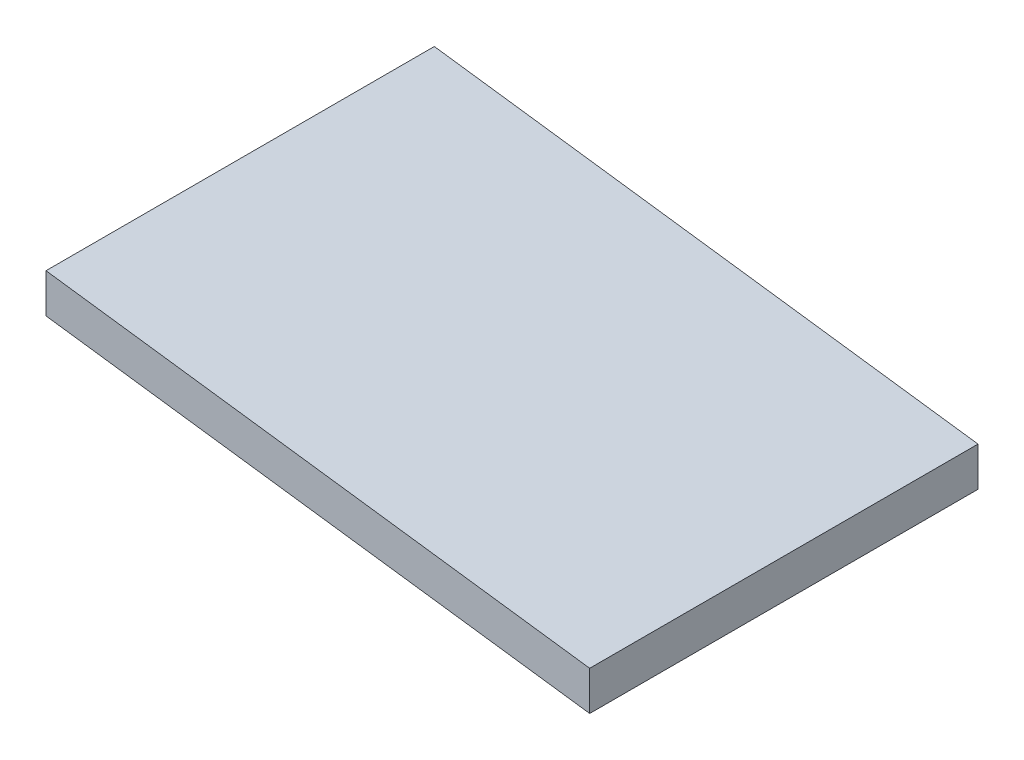
ISO-10303-21;
HEADER;
FILE_DESCRIPTION(('STEP AP214'),'2;1');
FILE_NAME('part.step','',(''),(''),'','','');
FILE_SCHEMA(('AUTOMOTIVE_DESIGN { 1 0 10303 214 1 1 1 1 }'));
ENDSEC;
DATA;
#1=APPLICATION_CONTEXT('core data for automotive mechanical design processes');
#2=APPLICATION_PROTOCOL_DEFINITION('international standard','automotive_design',2000,#1);
#3=PRODUCT_CONTEXT('',#1,'mechanical');
#4=PRODUCT('Part','Part','',(#3));
#5=PRODUCT_RELATED_PRODUCT_CATEGORY('part','',(#4));
#6=PRODUCT_DEFINITION_FORMATION('','',#4);
#7=PRODUCT_DEFINITION_CONTEXT('part definition',#1,'design');
#8=PRODUCT_DEFINITION('design','',#6,#7);
#9=PRODUCT_DEFINITION_SHAPE('','',#8);
#10=(LENGTH_UNIT() NAMED_UNIT(*) SI_UNIT(.MILLI.,.METRE.));
#11=(NAMED_UNIT(*) PLANE_ANGLE_UNIT() SI_UNIT($,.RADIAN.));
#12=(NAMED_UNIT(*) SI_UNIT($,.STERADIAN.) SOLID_ANGLE_UNIT());
#13=UNCERTAINTY_MEASURE_WITH_UNIT(LENGTH_MEASURE(1.E-05),#10,'distance_accuracy_value','');
#14=(GEOMETRIC_REPRESENTATION_CONTEXT(3) GLOBAL_UNCERTAINTY_ASSIGNED_CONTEXT((#13)) GLOBAL_UNIT_ASSIGNED_CONTEXT((#10,
#11,#12)) REPRESENTATION_CONTEXT('',''));
#15=CARTESIAN_POINT('',(0.,0.,0.));
#16=DIRECTION('',(0.,0.,1.));
#17=DIRECTION('',(1.,0.,0.));
#18=AXIS2_PLACEMENT_3D('',#15,#16,#17);
#19=CARTESIAN_POINT('',(0.,-10.0884973002811,100.));
#20=DIRECTION('',(1.,0.,0.));
#21=DIRECTION('',(0.,1.,0.));
#22=AXIS2_PLACEMENT_3D('',#19,#20,#21);
#23=PLANE('',#22);
#24=DIRECTION('',(0.,-1.,0.));
#25=VECTOR('',#24,1.);
#26=CARTESIAN_POINT('',(0.,-10.0884973002811,0.));
#27=LINE('',#26,#25);
#28=CARTESIAN_POINT('',(0.,0.,0.));
#29=VERTEX_POINT('',#28);
#30=CARTESIAN_POINT('',(0.,-10.0884973002811,0.));
#31=VERTEX_POINT('',#30);
#32=EDGE_CURVE('E102',#29,#31,#27,.T.);
#33=ORIENTED_EDGE('',*,*,#32,.T.);
#34=DIRECTION('',(0.,0.,-1.));
#35=VECTOR('',#34,1.);
#36=CARTESIAN_POINT('',(0.,-10.0884973002811,100.));
#37=LINE('',#36,#35);
#38=CARTESIAN_POINT('',(0.,-10.0884973002811,100.));
#39=VERTEX_POINT('',#38);
#40=EDGE_CURVE('E11',#39,#31,#37,.T.);
#41=ORIENTED_EDGE('',*,*,#40,.F.);
#42=DIRECTION('',(0.,-1.,0.));
#43=VECTOR('',#42,1.);
#44=CARTESIAN_POINT('',(0.,-10.0884973002811,100.));
#45=LINE('',#44,#43);
#46=CARTESIAN_POINT('',(0.,0.,100.));
#47=VERTEX_POINT('',#46);
#48=EDGE_CURVE('E90',#47,#39,#45,.T.);
#49=ORIENTED_EDGE('',*,*,#48,.F.);
#50=DIRECTION('',(0.,0.,-1.));
#51=VECTOR('',#50,1.);
#52=CARTESIAN_POINT('',(0.,0.,100.));
#53=LINE('',#52,#51);
#54=EDGE_CURVE('E98',#47,#29,#53,.T.);
#55=ORIENTED_EDGE('',*,*,#54,.T.);
#56=EDGE_LOOP('',(#33,#41,#49,#55));
#57=FACE_BOUND('',#56,.T.);
#58=ADVANCED_FACE('F39',(#57),#23,.F.);
#59=CARTESIAN_POINT('',(140.,-28.7551639669477,100.));
#60=DIRECTION('',(0.132163720091018,0.991227900682635,0.));
#61=DIRECTION('',(-0.991227900682635,0.132163720091018,0.));
#62=AXIS2_PLACEMENT_3D('',#59,#60,#61);
#63=PLANE('',#62);
#64=DIRECTION('',(0.991227900682635,-0.132163720091018,0.));
#65=VECTOR('',#64,1.);
#66=CARTESIAN_POINT('',(140.,-28.7551639669477,0.));
#67=LINE('',#66,#65);
#68=CARTESIAN_POINT('',(140.,-28.7551639669477,0.));
#69=VERTEX_POINT('',#68);
#70=EDGE_CURVE('E94',#31,#69,#67,.T.);
#71=ORIENTED_EDGE('',*,*,#70,.T.);
#72=DIRECTION('',(0.,0.,-1.));
#73=VECTOR('',#72,1.);
#74=CARTESIAN_POINT('',(140.,-28.7551639669477,100.));
#75=LINE('',#74,#73);
#76=CARTESIAN_POINT('',(140.,-28.7551639669477,100.));
#77=VERTEX_POINT('',#76);
#78=EDGE_CURVE('E47',#77,#69,#75,.T.);
#79=ORIENTED_EDGE('',*,*,#78,.F.);
#80=DIRECTION('',(0.991227900682635,-0.132163720091018,0.));
#81=VECTOR('',#80,1.);
#82=CARTESIAN_POINT('',(140.,-28.7551639669477,100.));
#83=LINE('',#82,#81);
#84=EDGE_CURVE('E85',#39,#77,#83,.T.);
#85=ORIENTED_EDGE('',*,*,#84,.F.);
#86=ORIENTED_EDGE('',*,*,#40,.T.);
#87=EDGE_LOOP('',(#71,#79,#85,#86));
#88=FACE_BOUND('',#87,.T.);
#89=ADVANCED_FACE('F93',(#88),#63,.F.);
#90=CARTESIAN_POINT('',(140.,-18.6666666666667,100.));
#91=DIRECTION('',(-1.,0.,0.));
#92=DIRECTION('',(0.,0.,1.));
#93=AXIS2_PLACEMENT_3D('',#90,#91,#92);
#94=PLANE('',#93);
#95=DIRECTION('',(0.,1.,0.));
#96=VECTOR('',#95,1.);
#97=CARTESIAN_POINT('',(140.,-18.6666666666667,0.));
#98=LINE('',#97,#96);
#99=CARTESIAN_POINT('',(140.,-18.6666666666667,0.));
#100=VERTEX_POINT('',#99);
#101=EDGE_CURVE('E72',#69,#100,#98,.T.);
#102=ORIENTED_EDGE('',*,*,#101,.T.);
#103=DIRECTION('',(0.,0.,-1.));
#104=VECTOR('',#103,1.);
#105=CARTESIAN_POINT('',(140.,-18.6666666666667,100.));
#106=LINE('',#105,#104);
#107=CARTESIAN_POINT('',(140.,-18.6666666666667,100.));
#108=VERTEX_POINT('',#107);
#109=EDGE_CURVE('E95',#108,#100,#106,.T.);
#110=ORIENTED_EDGE('',*,*,#109,.F.);
#111=DIRECTION('',(0.,1.,0.));
#112=VECTOR('',#111,1.);
#113=CARTESIAN_POINT('',(140.,-18.6666666666667,100.));
#114=LINE('',#113,#112);
#115=EDGE_CURVE('E88',#77,#108,#114,.T.);
#116=ORIENTED_EDGE('',*,*,#115,.F.);
#117=ORIENTED_EDGE('',*,*,#78,.T.);
#118=EDGE_LOOP('',(#102,#110,#116,#117));
#119=FACE_BOUND('',#118,.T.);
#120=ADVANCED_FACE('F96',(#119),#94,.F.);
#121=CARTESIAN_POINT('',(0.,0.,100.));
#122=DIRECTION('',(-0.132163720091018,-0.991227900682635,0.));
#123=DIRECTION('',(0.991227900682635,-0.132163720091018,0.));
#124=AXIS2_PLACEMENT_3D('',#121,#122,#123);
#125=PLANE('',#124);
#126=DIRECTION('',(-0.991227900682635,0.132163720091018,0.));
#127=VECTOR('',#126,1.);
#128=CARTESIAN_POINT('',(0.,0.,0.));
#129=LINE('',#128,#127);
#130=EDGE_CURVE('E78',#100,#29,#129,.T.);
#131=ORIENTED_EDGE('',*,*,#130,.T.);
#132=ORIENTED_EDGE('',*,*,#54,.F.);
#133=DIRECTION('',(-0.991227900682635,0.132163720091018,0.));
#134=VECTOR('',#133,1.);
#135=CARTESIAN_POINT('',(0.,0.,100.));
#136=LINE('',#135,#134);
#137=EDGE_CURVE('E55',#108,#47,#136,.T.);
#138=ORIENTED_EDGE('',*,*,#137,.F.);
#139=ORIENTED_EDGE('',*,*,#109,.T.);
#140=EDGE_LOOP('',(#131,#132,#138,#139));
#141=FACE_BOUND('',#140,.T.);
#142=ADVANCED_FACE('F109',(#141),#125,.F.);
#143=CARTESIAN_POINT('',(0.,0.,100.));
#144=DIRECTION('',(0.,0.,-1.));
#145=DIRECTION('',(-1.,0.,0.));
#146=AXIS2_PLACEMENT_3D('',#143,#144,#145);
#147=PLANE('',#146);
#148=ORIENTED_EDGE('',*,*,#48,.T.);
#149=ORIENTED_EDGE('',*,*,#84,.T.);
#150=ORIENTED_EDGE('',*,*,#115,.T.);
#151=ORIENTED_EDGE('',*,*,#137,.T.);
#152=EDGE_LOOP('',(#148,#149,#150,#151));
#153=FACE_BOUND('',#152,.T.);
#154=ADVANCED_FACE('F86',(#153),#147,.F.);
#155=CARTESIAN_POINT('',(0.,0.,0.));
#156=DIRECTION('',(0.,0.,-1.));
#157=DIRECTION('',(-1.,0.,0.));
#158=AXIS2_PLACEMENT_3D('',#155,#156,#157);
#159=PLANE('',#158);
#160=ORIENTED_EDGE('',*,*,#32,.F.);
#161=ORIENTED_EDGE('',*,*,#130,.F.);
#162=ORIENTED_EDGE('',*,*,#101,.F.);
#163=ORIENTED_EDGE('',*,*,#70,.F.);
#164=EDGE_LOOP('',(#160,#161,#162,#163));
#165=FACE_BOUND('',#164,.T.);
#166=ADVANCED_FACE('F112',(#165),#159,.T.);
#167=CLOSED_SHELL('',(#58,#89,#120,#142,#154,#166));
#168=MANIFOLD_SOLID_BREP('B2',#167);
#169=ADVANCED_BREP_SHAPE_REPRESENTATION('',(#18,#168),#14);
#170=SHAPE_DEFINITION_REPRESENTATION(#9,#169);
ENDSEC;
END-ISO-10303-21;
